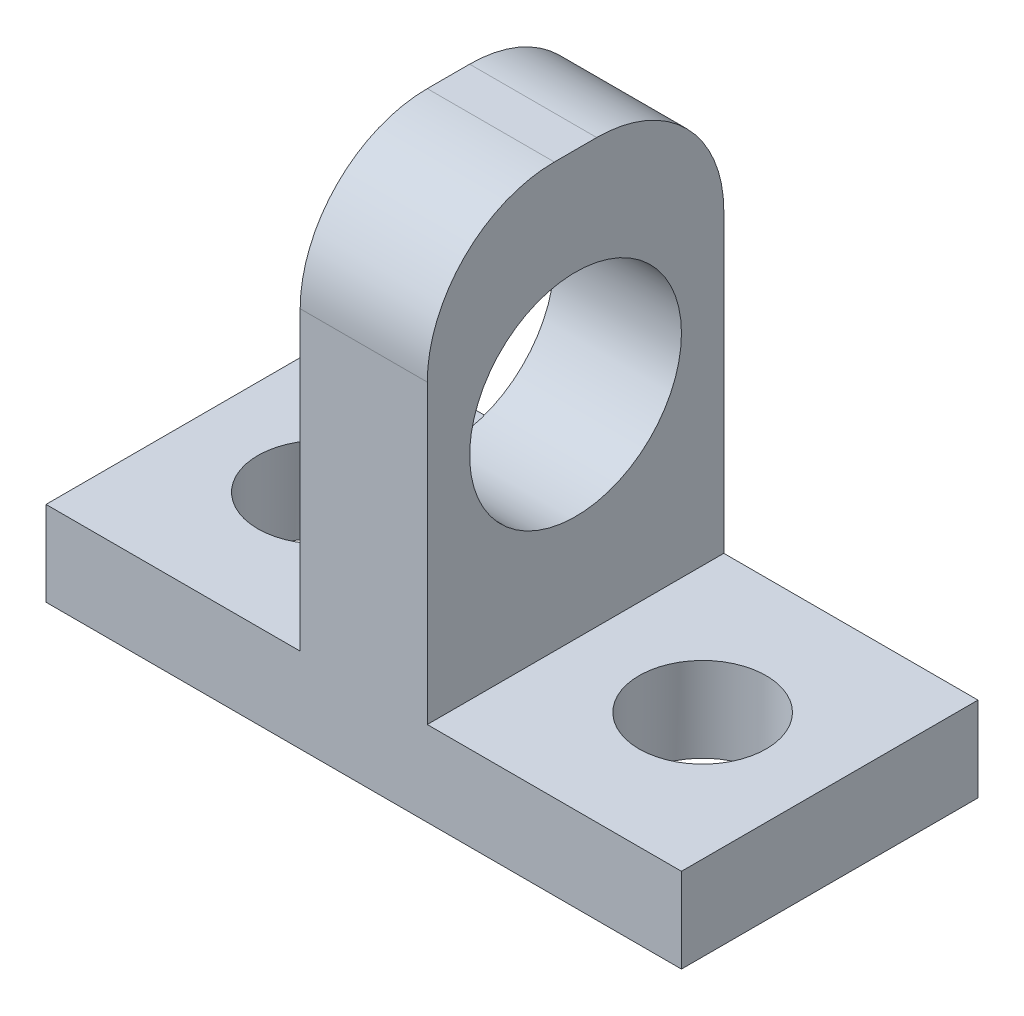
ISO-10303-21;
HEADER;
FILE_DESCRIPTION(('STEP AP214'),'2;1');
FILE_NAME('part.step','',(''),(''),'','','');
FILE_SCHEMA(('AUTOMOTIVE_DESIGN { 1 0 10303 214 1 1 1 1 }'));
ENDSEC;
DATA;
#1=APPLICATION_CONTEXT('core data for automotive mechanical design processes');
#2=APPLICATION_PROTOCOL_DEFINITION('international standard','automotive_design',2000,#1);
#3=PRODUCT_CONTEXT('',#1,'mechanical');
#4=PRODUCT('Part','Part','',(#3));
#5=PRODUCT_RELATED_PRODUCT_CATEGORY('part','',(#4));
#6=PRODUCT_DEFINITION_FORMATION('','',#4);
#7=PRODUCT_DEFINITION_CONTEXT('part definition',#1,'design');
#8=PRODUCT_DEFINITION('design','',#6,#7);
#9=PRODUCT_DEFINITION_SHAPE('','',#8);
#10=(LENGTH_UNIT() NAMED_UNIT(*) SI_UNIT(.MILLI.,.METRE.));
#11=(NAMED_UNIT(*) PLANE_ANGLE_UNIT() SI_UNIT($,.RADIAN.));
#12=(NAMED_UNIT(*) SI_UNIT($,.STERADIAN.) SOLID_ANGLE_UNIT());
#13=UNCERTAINTY_MEASURE_WITH_UNIT(LENGTH_MEASURE(1.E-05),#10,'distance_accuracy_value','');
#14=(GEOMETRIC_REPRESENTATION_CONTEXT(3) GLOBAL_UNCERTAINTY_ASSIGNED_CONTEXT((#13)) GLOBAL_UNIT_ASSIGNED_CONTEXT((#10,
#11,#12)) REPRESENTATION_CONTEXT('',''));
#15=CARTESIAN_POINT('',(0.,0.,0.));
#16=DIRECTION('',(0.,0.,1.));
#17=DIRECTION('',(1.,0.,0.));
#18=AXIS2_PLACEMENT_3D('',#15,#16,#17);
#19=CARTESIAN_POINT('',(0.,2.,0.));
#20=DIRECTION('',(0.,-1.,0.));
#21=DIRECTION('',(0.,0.,-1.));
#22=AXIS2_PLACEMENT_3D('',#19,#20,#21);
#23=PLANE('',#22);
#24=CARTESIAN_POINT('',(-4.5,2.,0.));
#25=DIRECTION('',(0.,1.,0.));
#26=DIRECTION('',(0.,0.,1.));
#27=AXIS2_PLACEMENT_3D('',#24,#25,#26);
#28=CIRCLE('',#27,1.5);
#29=CARTESIAN_POINT('',(-4.5,2.,1.5));
#30=VERTEX_POINT('',#29);
#31=EDGE_CURVE('E201',#30,#30,#28,.T.);
#32=ORIENTED_EDGE('',*,*,#31,.F.);
#33=EDGE_LOOP('',(#32));
#34=FACE_BOUND('',#33,.T.);
#35=DIRECTION('',(0.,0.,1.));
#36=VECTOR('',#35,1.);
#37=CARTESIAN_POINT('',(-1.5,2.,3.5));
#38=LINE('',#37,#36);
#39=CARTESIAN_POINT('',(-1.5,2.,-3.5));
#40=VERTEX_POINT('',#39);
#41=CARTESIAN_POINT('',(-1.5,2.,3.5));
#42=VERTEX_POINT('',#41);
#43=EDGE_CURVE('E141',#40,#42,#38,.T.);
#44=ORIENTED_EDGE('',*,*,#43,.F.);
#45=DIRECTION('',(-1.,0.,0.));
#46=VECTOR('',#45,1.);
#47=CARTESIAN_POINT('',(-7.5,2.,-3.5));
#48=LINE('',#47,#46);
#49=CARTESIAN_POINT('',(-7.5,2.,-3.5));
#50=VERTEX_POINT('',#49);
#51=EDGE_CURVE('E137',#40,#50,#48,.T.);
#52=ORIENTED_EDGE('',*,*,#51,.T.);
#53=DIRECTION('',(0.,0.,1.));
#54=VECTOR('',#53,1.);
#55=CARTESIAN_POINT('',(-7.5,2.,3.5));
#56=LINE('',#55,#54);
#57=CARTESIAN_POINT('',(-7.5,2.,3.5));
#58=VERTEX_POINT('',#57);
#59=EDGE_CURVE('E136',#50,#58,#56,.T.);
#60=ORIENTED_EDGE('',*,*,#59,.T.);
#61=DIRECTION('',(1.,0.,0.));
#62=VECTOR('',#61,1.);
#63=CARTESIAN_POINT('',(-7.5,2.,3.5));
#64=LINE('',#63,#62);
#65=EDGE_CURVE('E160',#58,#42,#64,.T.);
#66=ORIENTED_EDGE('',*,*,#65,.T.);
#67=EDGE_LOOP('',(#44,#52,#60,#66));
#68=FACE_BOUND('',#67,.T.);
#69=ADVANCED_FACE('F41',(#34,#68),#23,.F.);
#70=CARTESIAN_POINT('',(4.5,2.,0.));
#71=DIRECTION('',(0.,1.,0.));
#72=DIRECTION('',(0.,0.,1.));
#73=AXIS2_PLACEMENT_3D('',#70,#71,#72);
#74=CIRCLE('',#73,1.5);
#75=CARTESIAN_POINT('',(4.5,2.,1.5));
#76=VERTEX_POINT('',#75);
#77=EDGE_CURVE('E195',#76,#76,#74,.T.);
#78=ORIENTED_EDGE('',*,*,#77,.F.);
#79=EDGE_LOOP('',(#78));
#80=FACE_BOUND('',#79,.T.);
#81=DIRECTION('',(0.,0.,-1.));
#82=VECTOR('',#81,1.);
#83=CARTESIAN_POINT('',(1.5,2.,3.5));
#84=LINE('',#83,#82);
#85=CARTESIAN_POINT('',(1.5,2.,3.5));
#86=VERTEX_POINT('',#85);
#87=CARTESIAN_POINT('',(1.5,2.,-3.5));
#88=VERTEX_POINT('',#87);
#89=EDGE_CURVE('E131',#86,#88,#84,.T.);
#90=ORIENTED_EDGE('',*,*,#89,.F.);
#91=CARTESIAN_POINT('',(7.5,2.,3.5));
#92=VERTEX_POINT('',#91);
#93=EDGE_CURVE('E159',#86,#92,#64,.T.);
#94=ORIENTED_EDGE('',*,*,#93,.T.);
#95=DIRECTION('',(0.,0.,-1.));
#96=VECTOR('',#95,1.);
#97=CARTESIAN_POINT('',(7.5,2.,3.5));
#98=LINE('',#97,#96);
#99=CARTESIAN_POINT('',(7.5,2.,-3.5));
#100=VERTEX_POINT('',#99);
#101=EDGE_CURVE('E134',#92,#100,#98,.T.);
#102=ORIENTED_EDGE('',*,*,#101,.T.);
#103=EDGE_CURVE('E121',#100,#88,#48,.T.);
#104=ORIENTED_EDGE('',*,*,#103,.T.);
#105=EDGE_LOOP('',(#90,#94,#102,#104));
#106=FACE_BOUND('',#105,.T.);
#107=ADVANCED_FACE('F130',(#80,#106),#23,.F.);
#108=CARTESIAN_POINT('',(7.5,2.,3.5));
#109=DIRECTION('',(-1.,0.,0.));
#110=DIRECTION('',(0.,0.,1.));
#111=AXIS2_PLACEMENT_3D('',#108,#109,#110);
#112=PLANE('',#111);
#113=DIRECTION('',(0.,0.,-1.));
#114=VECTOR('',#113,1.);
#115=CARTESIAN_POINT('',(7.5,0.,3.5));
#116=LINE('',#115,#114);
#117=CARTESIAN_POINT('',(7.5,0.,3.5));
#118=VERTEX_POINT('',#117);
#119=CARTESIAN_POINT('',(7.5,0.,-3.5));
#120=VERTEX_POINT('',#119);
#121=EDGE_CURVE('E155',#118,#120,#116,.T.);
#122=ORIENTED_EDGE('',*,*,#121,.T.);
#123=DIRECTION('',(0.,-1.,0.));
#124=VECTOR('',#123,1.);
#125=CARTESIAN_POINT('',(7.5,2.,-3.5));
#126=LINE('',#125,#124);
#127=EDGE_CURVE('E179',#100,#120,#126,.T.);
#128=ORIENTED_EDGE('',*,*,#127,.F.);
#129=ORIENTED_EDGE('',*,*,#101,.F.);
#130=DIRECTION('',(0.,-1.,0.));
#131=VECTOR('',#130,1.);
#132=CARTESIAN_POINT('',(7.5,2.,3.5));
#133=LINE('',#132,#131);
#134=EDGE_CURVE('E163',#92,#118,#133,.T.);
#135=ORIENTED_EDGE('',*,*,#134,.T.);
#136=EDGE_LOOP('',(#122,#128,#129,#135));
#137=FACE_BOUND('',#136,.T.);
#138=ADVANCED_FACE('F238',(#137),#112,.F.);
#139=CARTESIAN_POINT('',(-7.5,2.,-3.5));
#140=DIRECTION('',(0.,0.,1.));
#141=DIRECTION('',(1.,0.,0.));
#142=AXIS2_PLACEMENT_3D('',#139,#140,#141);
#143=PLANE('',#142);
#144=DIRECTION('',(0.,-1.,0.));
#145=VECTOR('',#144,1.);
#146=CARTESIAN_POINT('',(-1.5,12.,-3.5));
#147=LINE('',#146,#145);
#148=CARTESIAN_POINT('',(-1.5,9.,-3.5));
#149=VERTEX_POINT('',#148);
#150=EDGE_CURVE('E126',#149,#40,#147,.T.);
#151=ORIENTED_EDGE('',*,*,#150,.F.);
#152=DIRECTION('',(-1.,0.,0.));
#153=VECTOR('',#152,1.);
#154=CARTESIAN_POINT('',(1.5,9.,-3.5));
#155=LINE('',#154,#153);
#156=CARTESIAN_POINT('',(1.5,9.,-3.5));
#157=VERTEX_POINT('',#156);
#158=EDGE_CURVE('E66',#149,#157,#155,.F.);
#159=ORIENTED_EDGE('',*,*,#158,.T.);
#160=DIRECTION('',(0.,-1.,0.));
#161=VECTOR('',#160,1.);
#162=CARTESIAN_POINT('',(1.5,12.,-3.5));
#163=LINE('',#162,#161);
#164=EDGE_CURVE('E117',#157,#88,#163,.T.);
#165=ORIENTED_EDGE('',*,*,#164,.T.);
#166=ORIENTED_EDGE('',*,*,#103,.F.);
#167=ORIENTED_EDGE('',*,*,#127,.T.);
#168=DIRECTION('',(-1.,0.,0.));
#169=VECTOR('',#168,1.);
#170=CARTESIAN_POINT('',(-7.5,0.,-3.5));
#171=LINE('',#170,#169);
#172=CARTESIAN_POINT('',(-7.5,0.,-3.5));
#173=VERTEX_POINT('',#172);
#174=EDGE_CURVE('E166',#120,#173,#171,.T.);
#175=ORIENTED_EDGE('',*,*,#174,.T.);
#176=DIRECTION('',(0.,-1.,0.));
#177=VECTOR('',#176,1.);
#178=CARTESIAN_POINT('',(-7.5,2.,-3.5));
#179=LINE('',#178,#177);
#180=EDGE_CURVE('E176',#50,#173,#179,.T.);
#181=ORIENTED_EDGE('',*,*,#180,.F.);
#182=ORIENTED_EDGE('',*,*,#51,.F.);
#183=EDGE_LOOP('',(#151,#159,#165,#166,#167,#175,#181,#182));
#184=FACE_BOUND('',#183,.T.);
#185=ADVANCED_FACE('F119',(#184),#143,.F.);
#186=CARTESIAN_POINT('',(-7.5,2.,3.5));
#187=DIRECTION('',(1.,0.,0.));
#188=DIRECTION('',(0.,0.,-1.));
#189=AXIS2_PLACEMENT_3D('',#186,#187,#188);
#190=PLANE('',#189);
#191=DIRECTION('',(0.,0.,1.));
#192=VECTOR('',#191,1.);
#193=CARTESIAN_POINT('',(-7.5,0.,3.5));
#194=LINE('',#193,#192);
#195=CARTESIAN_POINT('',(-7.5,0.,3.5));
#196=VERTEX_POINT('',#195);
#197=EDGE_CURVE('E168',#173,#196,#194,.T.);
#198=ORIENTED_EDGE('',*,*,#197,.T.);
#199=DIRECTION('',(0.,-1.,0.));
#200=VECTOR('',#199,1.);
#201=CARTESIAN_POINT('',(-7.5,2.,3.5));
#202=LINE('',#201,#200);
#203=EDGE_CURVE('E173',#58,#196,#202,.T.);
#204=ORIENTED_EDGE('',*,*,#203,.F.);
#205=ORIENTED_EDGE('',*,*,#59,.F.);
#206=ORIENTED_EDGE('',*,*,#180,.T.);
#207=EDGE_LOOP('',(#198,#204,#205,#206));
#208=FACE_BOUND('',#207,.T.);
#209=ADVANCED_FACE('F242',(#208),#190,.F.);
#210=CARTESIAN_POINT('',(-7.5,2.,3.5));
#211=DIRECTION('',(0.,0.,-1.));
#212=DIRECTION('',(-1.,0.,0.));
#213=AXIS2_PLACEMENT_3D('',#210,#211,#212);
#214=PLANE('',#213);
#215=DIRECTION('',(0.,-1.,0.));
#216=VECTOR('',#215,1.);
#217=CARTESIAN_POINT('',(1.5,12.,3.5));
#218=LINE('',#217,#216);
#219=CARTESIAN_POINT('',(1.5,9.,3.5));
#220=VERTEX_POINT('',#219);
#221=EDGE_CURVE('E125',#220,#86,#218,.T.);
#222=ORIENTED_EDGE('',*,*,#221,.F.);
#223=DIRECTION('',(1.,0.,0.));
#224=VECTOR('',#223,1.);
#225=CARTESIAN_POINT('',(-1.5,9.,3.5));
#226=LINE('',#225,#224);
#227=CARTESIAN_POINT('',(-1.5,9.,3.5));
#228=VERTEX_POINT('',#227);
#229=EDGE_CURVE('E11',#220,#228,#226,.F.);
#230=ORIENTED_EDGE('',*,*,#229,.T.);
#231=DIRECTION('',(0.,-1.,0.));
#232=VECTOR('',#231,1.);
#233=CARTESIAN_POINT('',(-1.5,12.,3.5));
#234=LINE('',#233,#232);
#235=EDGE_CURVE('E153',#228,#42,#234,.T.);
#236=ORIENTED_EDGE('',*,*,#235,.T.);
#237=ORIENTED_EDGE('',*,*,#65,.F.);
#238=ORIENTED_EDGE('',*,*,#203,.T.);
#239=DIRECTION('',(1.,0.,0.));
#240=VECTOR('',#239,1.);
#241=CARTESIAN_POINT('',(-7.5,0.,3.5));
#242=LINE('',#241,#240);
#243=EDGE_CURVE('E156',#196,#118,#242,.T.);
#244=ORIENTED_EDGE('',*,*,#243,.T.);
#245=ORIENTED_EDGE('',*,*,#134,.F.);
#246=ORIENTED_EDGE('',*,*,#93,.F.);
#247=EDGE_LOOP('',(#222,#230,#236,#237,#238,#244,#245,#246));
#248=FACE_BOUND('',#247,.T.);
#249=ADVANCED_FACE('F233',(#248),#214,.F.);
#250=CARTESIAN_POINT('',(0.,0.,0.));
#251=DIRECTION('',(0.,-1.,0.));
#252=DIRECTION('',(0.,0.,-1.));
#253=AXIS2_PLACEMENT_3D('',#250,#251,#252);
#254=PLANE('',#253);
#255=CARTESIAN_POINT('',(4.5,0.,0.));
#256=DIRECTION('',(0.,-1.,0.));
#257=DIRECTION('',(0.,0.,-1.));
#258=AXIS2_PLACEMENT_3D('',#255,#256,#257);
#259=CIRCLE('',#258,1.5);
#260=CARTESIAN_POINT('',(4.5,0.,-1.5));
#261=VERTEX_POINT('',#260);
#262=EDGE_CURVE('E45',#261,#261,#259,.T.);
#263=ORIENTED_EDGE('',*,*,#262,.F.);
#264=EDGE_LOOP('',(#263));
#265=FACE_BOUND('',#264,.T.);
#266=CARTESIAN_POINT('',(-4.5,0.,0.));
#267=DIRECTION('',(0.,-1.,0.));
#268=DIRECTION('',(0.,0.,-1.));
#269=AXIS2_PLACEMENT_3D('',#266,#267,#268);
#270=CIRCLE('',#269,1.5);
#271=CARTESIAN_POINT('',(-4.5,0.,-1.5));
#272=VERTEX_POINT('',#271);
#273=EDGE_CURVE('E193',#272,#272,#270,.T.);
#274=ORIENTED_EDGE('',*,*,#273,.F.);
#275=EDGE_LOOP('',(#274));
#276=FACE_BOUND('',#275,.T.);
#277=ORIENTED_EDGE('',*,*,#121,.F.);
#278=ORIENTED_EDGE('',*,*,#243,.F.);
#279=ORIENTED_EDGE('',*,*,#197,.F.);
#280=ORIENTED_EDGE('',*,*,#174,.F.);
#281=EDGE_LOOP('',(#277,#278,#279,#280));
#282=FACE_BOUND('',#281,.T.);
#283=ADVANCED_FACE('F243',(#265,#276,#282),#254,.T.);
#284=CARTESIAN_POINT('',(-1.5,12.,3.5));
#285=DIRECTION('',(1.,0.,0.));
#286=DIRECTION('',(0.,0.,-1.));
#287=AXIS2_PLACEMENT_3D('',#284,#285,#286);
#288=PLANE('',#287);
#289=CARTESIAN_POINT('',(-1.5,7.,0.));
#290=DIRECTION('',(1.,0.,0.));
#291=DIRECTION('',(0.,0.,-1.));
#292=AXIS2_PLACEMENT_3D('',#289,#290,#291);
#293=CIRCLE('',#292,2.5);
#294=CARTESIAN_POINT('',(-1.5,7.,-2.5));
#295=VERTEX_POINT('',#294);
#296=EDGE_CURVE('E147',#295,#295,#293,.T.);
#297=ORIENTED_EDGE('',*,*,#296,.T.);
#298=EDGE_LOOP('',(#297));
#299=FACE_BOUND('',#298,.T.);
#300=DIRECTION('',(0.,0.,1.));
#301=VECTOR('',#300,1.);
#302=CARTESIAN_POINT('',(-1.5,12.,3.5));
#303=LINE('',#302,#301);
#304=CARTESIAN_POINT('',(-1.5,12.,-0.5));
#305=VERTEX_POINT('',#304);
#306=CARTESIAN_POINT('',(-1.5,12.,0.5));
#307=VERTEX_POINT('',#306);
#308=EDGE_CURVE('E140',#305,#307,#303,.T.);
#309=ORIENTED_EDGE('',*,*,#308,.F.);
#310=CARTESIAN_POINT('',(-1.5,9.,-0.5));
#311=DIRECTION('',(1.,0.,0.));
#312=DIRECTION('',(0.,0.,-1.));
#313=AXIS2_PLACEMENT_3D('',#310,#311,#312);
#314=CIRCLE('',#313,3.);
#315=EDGE_CURVE('E189',#305,#149,#314,.F.);
#316=ORIENTED_EDGE('',*,*,#315,.T.);
#317=ORIENTED_EDGE('',*,*,#150,.T.);
#318=ORIENTED_EDGE('',*,*,#43,.T.);
#319=ORIENTED_EDGE('',*,*,#235,.F.);
#320=CARTESIAN_POINT('',(-1.5,9.,0.5));
#321=DIRECTION('',(1.,0.,0.));
#322=DIRECTION('',(0.,0.,-1.));
#323=AXIS2_PLACEMENT_3D('',#320,#321,#322);
#324=CIRCLE('',#323,3.);
#325=EDGE_CURVE('E187',#228,#307,#324,.F.);
#326=ORIENTED_EDGE('',*,*,#325,.T.);
#327=EDGE_LOOP('',(#309,#316,#317,#318,#319,#326));
#328=FACE_BOUND('',#327,.T.);
#329=ADVANCED_FACE('F220',(#299,#328),#288,.F.);
#330=CARTESIAN_POINT('',(1.5,12.,3.5));
#331=DIRECTION('',(-1.,0.,0.));
#332=DIRECTION('',(0.,0.,1.));
#333=AXIS2_PLACEMENT_3D('',#330,#331,#332);
#334=PLANE('',#333);
#335=CARTESIAN_POINT('',(1.5,7.,0.));
#336=DIRECTION('',(1.,0.,0.));
#337=DIRECTION('',(0.,0.,-1.));
#338=AXIS2_PLACEMENT_3D('',#335,#336,#337);
#339=CIRCLE('',#338,2.5);
#340=CARTESIAN_POINT('',(1.5,7.,-2.5));
#341=VERTEX_POINT('',#340);
#342=EDGE_CURVE('E199',#341,#341,#339,.T.);
#343=ORIENTED_EDGE('',*,*,#342,.F.);
#344=EDGE_LOOP('',(#343));
#345=FACE_BOUND('',#344,.T.);
#346=ORIENTED_EDGE('',*,*,#164,.F.);
#347=CARTESIAN_POINT('',(1.5,9.,-0.5));
#348=DIRECTION('',(-1.,0.,0.));
#349=DIRECTION('',(0.,0.,1.));
#350=AXIS2_PLACEMENT_3D('',#347,#348,#349);
#351=CIRCLE('',#350,3.);
#352=CARTESIAN_POINT('',(1.5,12.,-0.5));
#353=VERTEX_POINT('',#352);
#354=EDGE_CURVE('E50',#157,#353,#351,.F.);
#355=ORIENTED_EDGE('',*,*,#354,.T.);
#356=DIRECTION('',(0.,0.,-1.));
#357=VECTOR('',#356,1.);
#358=CARTESIAN_POINT('',(1.5,12.,3.5));
#359=LINE('',#358,#357);
#360=CARTESIAN_POINT('',(1.5,12.,0.5));
#361=VERTEX_POINT('',#360);
#362=EDGE_CURVE('E144',#361,#353,#359,.T.);
#363=ORIENTED_EDGE('',*,*,#362,.F.);
#364=CARTESIAN_POINT('',(1.5,9.,0.5));
#365=DIRECTION('',(-1.,0.,0.));
#366=DIRECTION('',(0.,0.,1.));
#367=AXIS2_PLACEMENT_3D('',#364,#365,#366);
#368=CIRCLE('',#367,3.);
#369=EDGE_CURVE('E58',#361,#220,#368,.F.);
#370=ORIENTED_EDGE('',*,*,#369,.T.);
#371=ORIENTED_EDGE('',*,*,#221,.T.);
#372=ORIENTED_EDGE('',*,*,#89,.T.);
#373=EDGE_LOOP('',(#346,#355,#363,#370,#371,#372));
#374=FACE_BOUND('',#373,.T.);
#375=ADVANCED_FACE('F139',(#345,#374),#334,.F.);
#376=CARTESIAN_POINT('',(0.,12.,0.));
#377=DIRECTION('',(0.,1.,0.));
#378=DIRECTION('',(0.,0.,1.));
#379=AXIS2_PLACEMENT_3D('',#376,#377,#378);
#380=PLANE('',#379);
#381=ORIENTED_EDGE('',*,*,#362,.T.);
#382=DIRECTION('',(-1.,0.,0.));
#383=VECTOR('',#382,1.);
#384=CARTESIAN_POINT('',(-1.5,12.,-0.5));
#385=LINE('',#384,#383);
#386=EDGE_CURVE('E184',#353,#305,#385,.T.);
#387=ORIENTED_EDGE('',*,*,#386,.T.);
#388=ORIENTED_EDGE('',*,*,#308,.T.);
#389=DIRECTION('',(1.,0.,0.));
#390=VECTOR('',#389,1.);
#391=CARTESIAN_POINT('',(1.5,12.,0.5));
#392=LINE('',#391,#390);
#393=EDGE_CURVE('E181',#307,#361,#392,.T.);
#394=ORIENTED_EDGE('',*,*,#393,.T.);
#395=EDGE_LOOP('',(#381,#387,#388,#394));
#396=FACE_BOUND('',#395,.T.);
#397=ADVANCED_FACE('F214',(#396),#380,.T.);
#398=CARTESIAN_POINT('',(-8.5,7.,0.));
#399=DIRECTION('',(1.,0.,0.));
#400=DIRECTION('',(0.,0.,-1.));
#401=AXIS2_PLACEMENT_3D('',#398,#399,#400);
#402=CYLINDRICAL_SURFACE('',#401,2.5);
#403=ORIENTED_EDGE('',*,*,#342,.T.);
#404=EDGE_LOOP('',(#403));
#405=FACE_BOUND('',#404,.T.);
#406=ORIENTED_EDGE('',*,*,#296,.F.);
#407=EDGE_LOOP('',(#406));
#408=FACE_BOUND('',#407,.T.);
#409=ADVANCED_FACE('F270',(#405,#408),#402,.F.);
#410=CARTESIAN_POINT('',(0.,9.,-0.5));
#411=DIRECTION('',(1.,0.,0.));
#412=DIRECTION('',(0.,0.,-1.));
#413=AXIS2_PLACEMENT_3D('',#410,#411,#412);
#414=CYLINDRICAL_SURFACE('',#413,3.);
#415=ORIENTED_EDGE('',*,*,#354,.F.);
#416=ORIENTED_EDGE('',*,*,#158,.F.);
#417=ORIENTED_EDGE('',*,*,#315,.F.);
#418=ORIENTED_EDGE('',*,*,#386,.F.);
#419=EDGE_LOOP('',(#415,#416,#417,#418));
#420=FACE_BOUND('',#419,.T.);
#421=ADVANCED_FACE('F218',(#420),#414,.T.);
#422=CARTESIAN_POINT('',(0.,9.,0.5));
#423=DIRECTION('',(-1.,0.,0.));
#424=DIRECTION('',(0.,0.,1.));
#425=AXIS2_PLACEMENT_3D('',#422,#423,#424);
#426=CYLINDRICAL_SURFACE('',#425,3.);
#427=ORIENTED_EDGE('',*,*,#325,.F.);
#428=ORIENTED_EDGE('',*,*,#229,.F.);
#429=ORIENTED_EDGE('',*,*,#369,.F.);
#430=ORIENTED_EDGE('',*,*,#393,.F.);
#431=EDGE_LOOP('',(#427,#428,#429,#430));
#432=FACE_BOUND('',#431,.T.);
#433=ADVANCED_FACE('F43',(#432),#426,.T.);
#434=CARTESIAN_POINT('',(-4.5,-8.,0.));
#435=DIRECTION('',(0.,1.,0.));
#436=DIRECTION('',(0.,0.,1.));
#437=AXIS2_PLACEMENT_3D('',#434,#435,#436);
#438=CYLINDRICAL_SURFACE('',#437,1.5);
#439=ORIENTED_EDGE('',*,*,#273,.T.);
#440=EDGE_LOOP('',(#439));
#441=FACE_BOUND('',#440,.T.);
#442=ORIENTED_EDGE('',*,*,#31,.T.);
#443=EDGE_LOOP('',(#442));
#444=FACE_BOUND('',#443,.T.);
#445=ADVANCED_FACE('F274',(#441,#444),#438,.F.);
#446=CARTESIAN_POINT('',(4.5,-8.,0.));
#447=DIRECTION('',(0.,1.,0.));
#448=DIRECTION('',(0.,0.,1.));
#449=AXIS2_PLACEMENT_3D('',#446,#447,#448);
#450=CYLINDRICAL_SURFACE('',#449,1.5);
#451=ORIENTED_EDGE('',*,*,#262,.T.);
#452=EDGE_LOOP('',(#451));
#453=FACE_BOUND('',#452,.T.);
#454=ORIENTED_EDGE('',*,*,#77,.T.);
#455=EDGE_LOOP('',(#454));
#456=FACE_BOUND('',#455,.T.);
#457=ADVANCED_FACE('F277',(#453,#456),#450,.F.);
#458=CLOSED_SHELL('',(#69,#107,#138,#185,#209,#249,#283,#329,#375,#397,#409,#421,#433,#445,#457));
#459=MANIFOLD_SOLID_BREP('B2',#458);
#460=ADVANCED_BREP_SHAPE_REPRESENTATION('',(#18,#459),#14);
#461=SHAPE_DEFINITION_REPRESENTATION(#9,#460);
ENDSEC;
END-ISO-10303-21;
